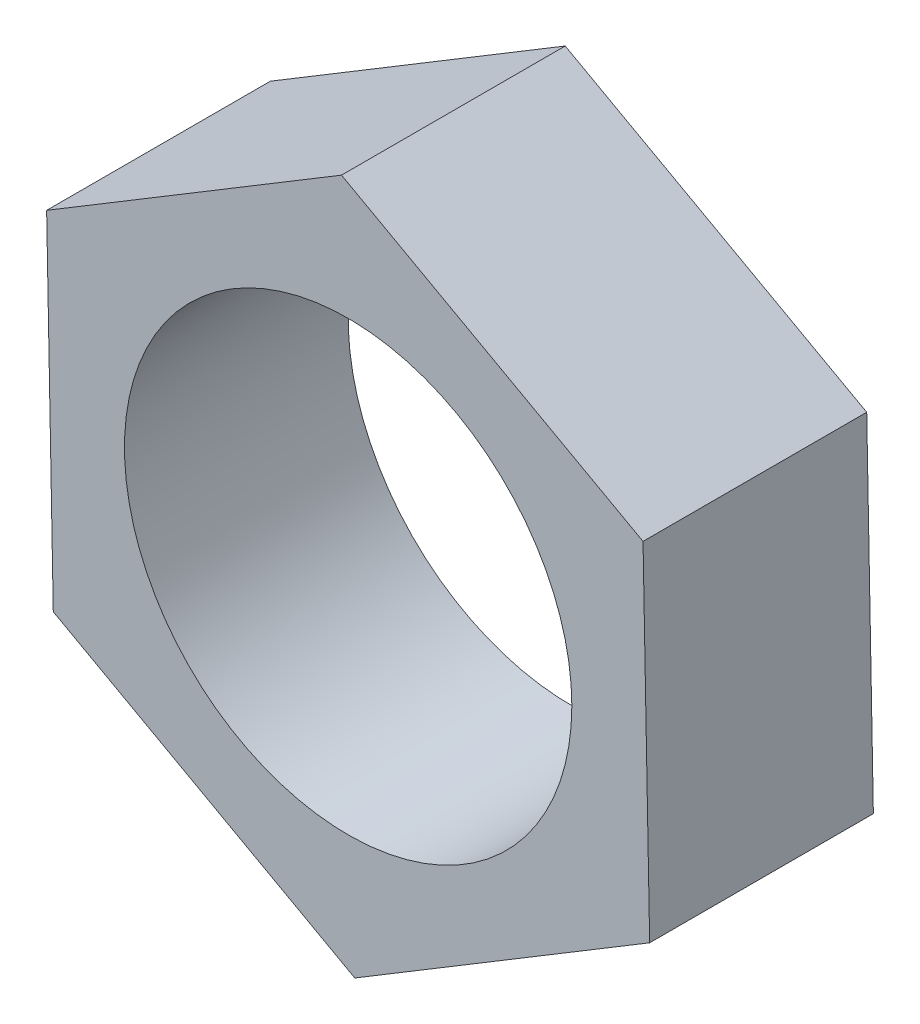
ISO-10303-21;
HEADER;
FILE_DESCRIPTION(('STEP AP214'),'2;1');
FILE_NAME('part.step','',(''),(''),'','','');
FILE_SCHEMA(('AUTOMOTIVE_DESIGN { 1 0 10303 214 1 1 1 1 }'));
ENDSEC;
DATA;
#1=APPLICATION_CONTEXT('core data for automotive mechanical design processes');
#2=APPLICATION_PROTOCOL_DEFINITION('international standard','automotive_design',2000,#1);
#3=PRODUCT_CONTEXT('',#1,'mechanical');
#4=PRODUCT('Part','Part','',(#3));
#5=PRODUCT_RELATED_PRODUCT_CATEGORY('part','',(#4));
#6=PRODUCT_DEFINITION_FORMATION('','',#4);
#7=PRODUCT_DEFINITION_CONTEXT('part definition',#1,'design');
#8=PRODUCT_DEFINITION('design','',#6,#7);
#9=PRODUCT_DEFINITION_SHAPE('','',#8);
#10=(LENGTH_UNIT() NAMED_UNIT(*) SI_UNIT(.MILLI.,.METRE.));
#11=(NAMED_UNIT(*) PLANE_ANGLE_UNIT() SI_UNIT($,.RADIAN.));
#12=(NAMED_UNIT(*) SI_UNIT($,.STERADIAN.) SOLID_ANGLE_UNIT());
#13=UNCERTAINTY_MEASURE_WITH_UNIT(LENGTH_MEASURE(1.E-05),#10,'distance_accuracy_value','');
#14=(GEOMETRIC_REPRESENTATION_CONTEXT(3) GLOBAL_UNCERTAINTY_ASSIGNED_CONTEXT((#13)) GLOBAL_UNIT_ASSIGNED_CONTEXT((#10,
#11,#12)) REPRESENTATION_CONTEXT('',''));
#15=CARTESIAN_POINT('',(0.,0.,0.));
#16=DIRECTION('',(0.,0.,1.));
#17=DIRECTION('',(1.,0.,0.));
#18=AXIS2_PLACEMENT_3D('',#15,#16,#17);
#19=CARTESIAN_POINT('',(4.04378299375658,-2.23184955423487,3.));
#20=DIRECTION('',(-0.999814112753406,-0.019280558579047,0.));
#21=DIRECTION('',(0.019280558579047,-0.999814112753406,0.));
#22=AXIS2_PLACEMENT_3D('',#19,#20,#21);
#23=PLANE('',#22);
#24=DIRECTION('',(-0.019280558579047,0.999814112753406,0.));
#25=VECTOR('',#24,1.);
#26=CARTESIAN_POINT('',(4.04378299375658,-2.23184955423487,0.));
#27=LINE('',#26,#25);
#28=CARTESIAN_POINT('',(4.04378299375658,-2.23184955423487,0.));
#29=VERTEX_POINT('',#28);
#30=CARTESIAN_POINT('',(3.95472990827067,2.38609402286725,0.));
#31=VERTEX_POINT('',#30);
#32=EDGE_CURVE('E118',#29,#31,#27,.T.);
#33=ORIENTED_EDGE('',*,*,#32,.T.);
#34=DIRECTION('',(0.,0.,-1.));
#35=VECTOR('',#34,1.);
#36=CARTESIAN_POINT('',(3.95472990827067,2.38609402286725,3.));
#37=LINE('',#36,#35);
#38=CARTESIAN_POINT('',(3.95472990827067,2.38609402286725,3.));
#39=VERTEX_POINT('',#38);
#40=EDGE_CURVE('E11',#39,#31,#37,.T.);
#41=ORIENTED_EDGE('',*,*,#40,.F.);
#42=DIRECTION('',(-0.019280558579047,0.999814112753406,0.));
#43=VECTOR('',#42,1.);
#44=CARTESIAN_POINT('',(4.04378299375658,-2.23184955423487,3.));
#45=LINE('',#44,#43);
#46=CARTESIAN_POINT('',(4.04378299375658,-2.23184955423487,3.));
#47=VERTEX_POINT('',#46);
#48=EDGE_CURVE('E128',#47,#39,#45,.T.);
#49=ORIENTED_EDGE('',*,*,#48,.F.);
#50=DIRECTION('',(0.,0.,-1.));
#51=VECTOR('',#50,1.);
#52=CARTESIAN_POINT('',(4.04378299375658,-2.23184955423487,3.));
#53=LINE('',#52,#51);
#54=EDGE_CURVE('E114',#47,#29,#53,.T.);
#55=ORIENTED_EDGE('',*,*,#54,.T.);
#56=EDGE_LOOP('',(#33,#41,#49,#55));
#57=FACE_BOUND('',#56,.T.);
#58=ADVANCED_FACE('F33',(#57),#23,.F.);
#59=CARTESIAN_POINT('',(3.95472990827067,2.38609402286725,3.));
#60=DIRECTION('',(-0.483209602848094,-0.875504699996172,0.));
#61=DIRECTION('',(0.875504699996172,-0.483209602848094,0.));
#62=AXIS2_PLACEMENT_3D('',#59,#60,#61);
#63=PLANE('',#62);
#64=DIRECTION('',(-0.875504699996172,0.483209602848094,0.));
#65=VECTOR('',#64,1.);
#66=CARTESIAN_POINT('',(3.95472990827067,2.38609402286725,0.));
#67=LINE('',#66,#65);
#68=CARTESIAN_POINT('',(-0.0890530854859127,4.61794357710212,0.));
#69=VERTEX_POINT('',#68);
#70=EDGE_CURVE('E121',#31,#69,#67,.T.);
#71=ORIENTED_EDGE('',*,*,#70,.T.);
#72=DIRECTION('',(0.,0.,-1.));
#73=VECTOR('',#72,1.);
#74=CARTESIAN_POINT('',(-0.0890530854859127,4.61794357710212,3.));
#75=LINE('',#74,#73);
#76=CARTESIAN_POINT('',(-0.0890530854859127,4.61794357710212,3.));
#77=VERTEX_POINT('',#76);
#78=EDGE_CURVE('E42',#77,#69,#75,.T.);
#79=ORIENTED_EDGE('',*,*,#78,.F.);
#80=DIRECTION('',(-0.875504699996172,0.483209602848094,0.));
#81=VECTOR('',#80,1.);
#82=CARTESIAN_POINT('',(3.95472990827067,2.38609402286725,3.));
#83=LINE('',#82,#81);
#84=EDGE_CURVE('E87',#39,#77,#83,.T.);
#85=ORIENTED_EDGE('',*,*,#84,.F.);
#86=ORIENTED_EDGE('',*,*,#40,.T.);
#87=EDGE_LOOP('',(#71,#79,#85,#86));
#88=FACE_BOUND('',#87,.T.);
#89=ADVANCED_FACE('F154',(#88),#63,.F.);
#90=CARTESIAN_POINT('',(-0.0890530854859127,4.61794357710212,3.));
#91=DIRECTION('',(0.516604509905311,-0.856224141417125,0.));
#92=DIRECTION('',(0.856224141417125,0.516604509905311,0.));
#93=AXIS2_PLACEMENT_3D('',#90,#91,#92);
#94=PLANE('',#93);
#95=DIRECTION('',(-0.856224141417125,-0.516604509905311,0.));
#96=VECTOR('',#95,1.);
#97=CARTESIAN_POINT('',(-0.0890530854859127,4.61794357710212,0.));
#98=LINE('',#97,#96);
#99=CARTESIAN_POINT('',(-4.04378299375658,2.23184955423487,0.));
#100=VERTEX_POINT('',#99);
#101=EDGE_CURVE('E123',#69,#100,#98,.T.);
#102=ORIENTED_EDGE('',*,*,#101,.T.);
#103=DIRECTION('',(0.,0.,-1.));
#104=VECTOR('',#103,1.);
#105=CARTESIAN_POINT('',(-4.04378299375658,2.23184955423487,3.));
#106=LINE('',#105,#104);
#107=CARTESIAN_POINT('',(-4.04378299375658,2.23184955423487,3.));
#108=VERTEX_POINT('',#107);
#109=EDGE_CURVE('E109',#108,#100,#106,.T.);
#110=ORIENTED_EDGE('',*,*,#109,.F.);
#111=DIRECTION('',(-0.856224141417125,-0.516604509905311,0.));
#112=VECTOR('',#111,1.);
#113=CARTESIAN_POINT('',(-0.0890530854859127,4.61794357710212,3.));
#114=LINE('',#113,#112);
#115=EDGE_CURVE('E100',#77,#108,#114,.T.);
#116=ORIENTED_EDGE('',*,*,#115,.F.);
#117=ORIENTED_EDGE('',*,*,#78,.T.);
#118=EDGE_LOOP('',(#102,#110,#116,#117));
#119=FACE_BOUND('',#118,.T.);
#120=ADVANCED_FACE('F135',(#119),#94,.F.);
#121=CARTESIAN_POINT('',(-4.04378299375658,2.23184955423487,3.));
#122=DIRECTION('',(0.999814112753406,0.0192805585790474,0.));
#123=DIRECTION('',(-0.0192805585790474,0.999814112753406,0.));
#124=AXIS2_PLACEMENT_3D('',#121,#122,#123);
#125=PLANE('',#124);
#126=DIRECTION('',(0.0192805585790474,-0.999814112753406,0.));
#127=VECTOR('',#126,1.);
#128=CARTESIAN_POINT('',(-4.04378299375658,2.23184955423487,0.));
#129=LINE('',#128,#127);
#130=CARTESIAN_POINT('',(-3.95472990827067,-2.38609402286725,0.));
#131=VERTEX_POINT('',#130);
#132=EDGE_CURVE('E108',#100,#131,#129,.T.);
#133=ORIENTED_EDGE('',*,*,#132,.T.);
#134=DIRECTION('',(0.,0.,-1.));
#135=VECTOR('',#134,1.);
#136=CARTESIAN_POINT('',(-3.95472990827067,-2.38609402286725,3.));
#137=LINE('',#136,#135);
#138=CARTESIAN_POINT('',(-3.95472990827067,-2.38609402286725,3.));
#139=VERTEX_POINT('',#138);
#140=EDGE_CURVE('E105',#139,#131,#137,.T.);
#141=ORIENTED_EDGE('',*,*,#140,.F.);
#142=DIRECTION('',(0.0192805585790474,-0.999814112753406,0.));
#143=VECTOR('',#142,1.);
#144=CARTESIAN_POINT('',(-4.04378299375658,2.23184955423487,3.));
#145=LINE('',#144,#143);
#146=EDGE_CURVE('E94',#108,#139,#145,.T.);
#147=ORIENTED_EDGE('',*,*,#146,.F.);
#148=ORIENTED_EDGE('',*,*,#109,.T.);
#149=EDGE_LOOP('',(#133,#141,#147,#148));
#150=FACE_BOUND('',#149,.T.);
#151=ADVANCED_FACE('F106',(#150),#125,.F.);
#152=CARTESIAN_POINT('',(-3.95472990827067,-2.38609402286725,3.));
#153=DIRECTION('',(0.483209602848094,0.875504699996172,0.));
#154=DIRECTION('',(-0.875504699996172,0.483209602848094,0.));
#155=AXIS2_PLACEMENT_3D('',#152,#153,#154);
#156=PLANE('',#155);
#157=DIRECTION('',(0.875504699996172,-0.483209602848094,0.));
#158=VECTOR('',#157,1.);
#159=CARTESIAN_POINT('',(-3.95472990827067,-2.38609402286725,0.));
#160=LINE('',#159,#158);
#161=CARTESIAN_POINT('',(0.0890530854859141,-4.61794357710212,0.));
#162=VERTEX_POINT('',#161);
#163=EDGE_CURVE('E73',#131,#162,#160,.T.);
#164=ORIENTED_EDGE('',*,*,#163,.T.);
#165=DIRECTION('',(0.,0.,-1.));
#166=VECTOR('',#165,1.);
#167=CARTESIAN_POINT('',(0.0890530854859141,-4.61794357710212,3.));
#168=LINE('',#167,#166);
#169=CARTESIAN_POINT('',(0.0890530854859141,-4.61794357710212,3.));
#170=VERTEX_POINT('',#169);
#171=EDGE_CURVE('E110',#170,#162,#168,.T.);
#172=ORIENTED_EDGE('',*,*,#171,.F.);
#173=DIRECTION('',(0.875504699996172,-0.483209602848094,0.));
#174=VECTOR('',#173,1.);
#175=CARTESIAN_POINT('',(-3.95472990827067,-2.38609402286725,3.));
#176=LINE('',#175,#174);
#177=EDGE_CURVE('E98',#139,#170,#176,.T.);
#178=ORIENTED_EDGE('',*,*,#177,.F.);
#179=ORIENTED_EDGE('',*,*,#140,.T.);
#180=EDGE_LOOP('',(#164,#172,#178,#179));
#181=FACE_BOUND('',#180,.T.);
#182=ADVANCED_FACE('F112',(#181),#156,.F.);
#183=CARTESIAN_POINT('',(0.0890530854859141,-4.61794357710212,3.));
#184=DIRECTION('',(-0.516604509905312,0.856224141417125,0.));
#185=DIRECTION('',(-0.856224141417125,-0.516604509905312,0.));
#186=AXIS2_PLACEMENT_3D('',#183,#184,#185);
#187=PLANE('',#186);
#188=DIRECTION('',(0.856224141417125,0.516604509905312,0.));
#189=VECTOR('',#188,1.);
#190=CARTESIAN_POINT('',(0.0890530854859141,-4.61794357710212,0.));
#191=LINE('',#190,#189);
#192=EDGE_CURVE('E79',#162,#29,#191,.T.);
#193=ORIENTED_EDGE('',*,*,#192,.T.);
#194=ORIENTED_EDGE('',*,*,#54,.F.);
#195=DIRECTION('',(0.856224141417125,0.516604509905312,0.));
#196=VECTOR('',#195,1.);
#197=CARTESIAN_POINT('',(0.0890530854859141,-4.61794357710212,3.));
#198=LINE('',#197,#196);
#199=EDGE_CURVE('E50',#170,#47,#198,.T.);
#200=ORIENTED_EDGE('',*,*,#199,.F.);
#201=ORIENTED_EDGE('',*,*,#171,.T.);
#202=EDGE_LOOP('',(#193,#194,#200,#201));
#203=FACE_BOUND('',#202,.T.);
#204=ADVANCED_FACE('F142',(#203),#187,.F.);
#205=CARTESIAN_POINT('',(0.,0.,3.));
#206=DIRECTION('',(0.,0.,1.));
#207=DIRECTION('',(1.,0.,0.));
#208=AXIS2_PLACEMENT_3D('',#205,#206,#207);
#209=PLANE('',#208);
#210=CARTESIAN_POINT('',(0.,0.,3.));
#211=DIRECTION('',(0.,0.,1.));
#212=DIRECTION('',(1.,0.,0.));
#213=AXIS2_PLACEMENT_3D('',#210,#211,#212);
#214=CIRCLE('',#213,3.);
#215=CARTESIAN_POINT('',(3.,0.,3.));
#216=VERTEX_POINT('',#215);
#217=EDGE_CURVE('E207',#216,#216,#214,.T.);
#218=ORIENTED_EDGE('',*,*,#217,.F.);
#219=EDGE_LOOP('',(#218));
#220=FACE_BOUND('',#219,.T.);
#221=ORIENTED_EDGE('',*,*,#48,.T.);
#222=ORIENTED_EDGE('',*,*,#84,.T.);
#223=ORIENTED_EDGE('',*,*,#115,.T.);
#224=ORIENTED_EDGE('',*,*,#146,.T.);
#225=ORIENTED_EDGE('',*,*,#177,.T.);
#226=ORIENTED_EDGE('',*,*,#199,.T.);
#227=EDGE_LOOP('',(#221,#222,#223,#224,#225,#226));
#228=FACE_BOUND('',#227,.T.);
#229=ADVANCED_FACE('F96',(#220,#228),#209,.T.);
#230=CARTESIAN_POINT('',(0.,0.,0.));
#231=DIRECTION('',(0.,0.,1.));
#232=DIRECTION('',(1.,0.,0.));
#233=AXIS2_PLACEMENT_3D('',#230,#231,#232);
#234=PLANE('',#233);
#235=CARTESIAN_POINT('',(0.,0.,0.));
#236=DIRECTION('',(0.,0.,1.));
#237=DIRECTION('',(1.,0.,0.));
#238=AXIS2_PLACEMENT_3D('',#235,#236,#237);
#239=CIRCLE('',#238,3.);
#240=CARTESIAN_POINT('',(3.,0.,0.));
#241=VERTEX_POINT('',#240);
#242=EDGE_CURVE('E36',#241,#241,#239,.T.);
#243=ORIENTED_EDGE('',*,*,#242,.T.);
#244=EDGE_LOOP('',(#243));
#245=FACE_BOUND('',#244,.T.);
#246=ORIENTED_EDGE('',*,*,#32,.F.);
#247=ORIENTED_EDGE('',*,*,#192,.F.);
#248=ORIENTED_EDGE('',*,*,#163,.F.);
#249=ORIENTED_EDGE('',*,*,#132,.F.);
#250=ORIENTED_EDGE('',*,*,#101,.F.);
#251=ORIENTED_EDGE('',*,*,#70,.F.);
#252=EDGE_LOOP('',(#246,#247,#248,#249,#250,#251));
#253=FACE_BOUND('',#252,.T.);
#254=ADVANCED_FACE('F138',(#245,#253),#234,.F.);
#255=CARTESIAN_POINT('',(0.,0.,-17.));
#256=DIRECTION('',(0.,0.,1.));
#257=DIRECTION('',(1.,0.,0.));
#258=AXIS2_PLACEMENT_3D('',#255,#256,#257);
#259=CYLINDRICAL_SURFACE('',#258,3.);
#260=ORIENTED_EDGE('',*,*,#217,.T.);
#261=EDGE_LOOP('',(#260));
#262=FACE_BOUND('',#261,.T.);
#263=ORIENTED_EDGE('',*,*,#242,.F.);
#264=EDGE_LOOP('',(#263));
#265=FACE_BOUND('',#264,.T.);
#266=ADVANCED_FACE('F191',(#262,#265),#259,.F.);
#267=CLOSED_SHELL('',(#58,#89,#120,#151,#182,#204,#229,#254,#266));
#268=MANIFOLD_SOLID_BREP('B2',#267);
#269=ADVANCED_BREP_SHAPE_REPRESENTATION('',(#18,#268),#14);
#270=SHAPE_DEFINITION_REPRESENTATION(#9,#269);
ENDSEC;
END-ISO-10303-21;
